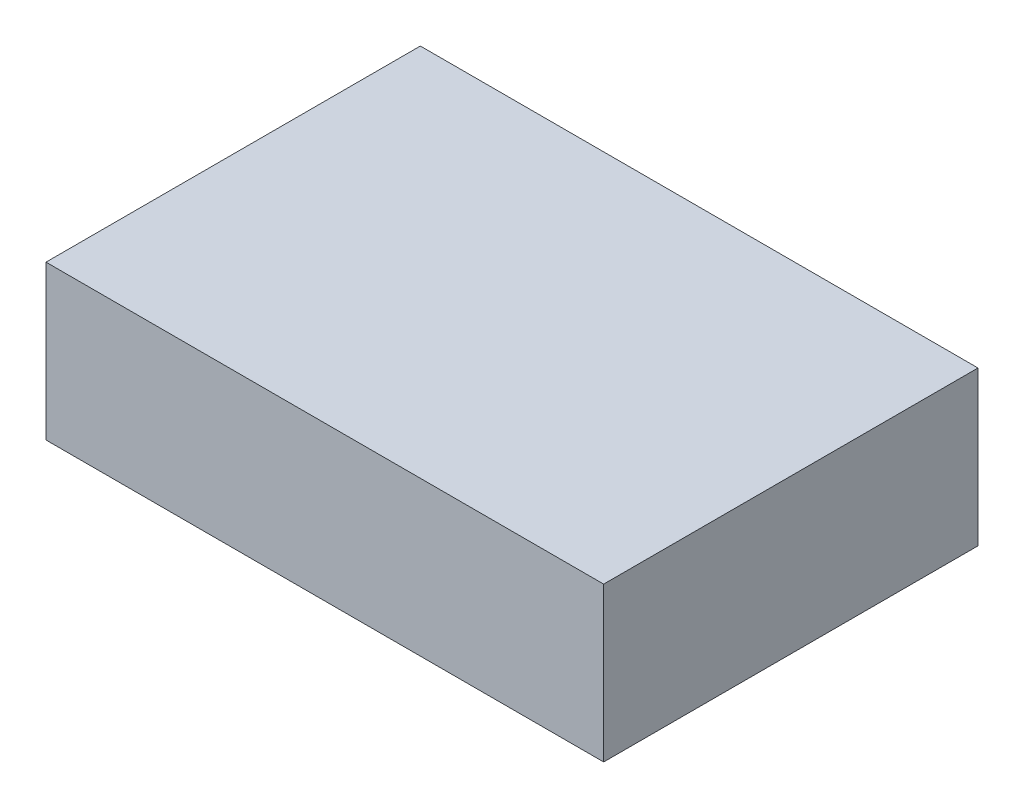
ISO-10303-21;
HEADER;
FILE_DESCRIPTION(('STEP AP214'),'2;1');
FILE_NAME('part.step','',(''),(''),'','','');
FILE_SCHEMA(('AUTOMOTIVE_DESIGN { 1 0 10303 214 1 1 1 1 }'));
ENDSEC;
DATA;
#1=APPLICATION_CONTEXT('core data for automotive mechanical design processes');
#2=APPLICATION_PROTOCOL_DEFINITION('international standard','automotive_design',2000,#1);
#3=PRODUCT_CONTEXT('',#1,'mechanical');
#4=PRODUCT('Part','Part','',(#3));
#5=PRODUCT_RELATED_PRODUCT_CATEGORY('part','',(#4));
#6=PRODUCT_DEFINITION_FORMATION('','',#4);
#7=PRODUCT_DEFINITION_CONTEXT('part definition',#1,'design');
#8=PRODUCT_DEFINITION('design','',#6,#7);
#9=PRODUCT_DEFINITION_SHAPE('','',#8);
#10=(LENGTH_UNIT() NAMED_UNIT(*) SI_UNIT(.MILLI.,.METRE.));
#11=(NAMED_UNIT(*) PLANE_ANGLE_UNIT() SI_UNIT($,.RADIAN.));
#12=(NAMED_UNIT(*) SI_UNIT($,.STERADIAN.) SOLID_ANGLE_UNIT());
#13=UNCERTAINTY_MEASURE_WITH_UNIT(LENGTH_MEASURE(1.E-05),#10,'distance_accuracy_value','');
#14=(GEOMETRIC_REPRESENTATION_CONTEXT(3) GLOBAL_UNCERTAINTY_ASSIGNED_CONTEXT((#13)) GLOBAL_UNIT_ASSIGNED_CONTEXT((#10,
#11,#12)) REPRESENTATION_CONTEXT('',''));
#15=CARTESIAN_POINT('',(0.,0.,0.));
#16=DIRECTION('',(0.,0.,1.));
#17=DIRECTION('',(1.,0.,0.));
#18=AXIS2_PLACEMENT_3D('',#15,#16,#17);
#19=CARTESIAN_POINT('',(18.1,10.,12.15));
#20=DIRECTION('',(-1.,0.,0.));
#21=DIRECTION('',(0.,0.,1.));
#22=AXIS2_PLACEMENT_3D('',#19,#20,#21);
#23=PLANE('',#22);
#24=DIRECTION('',(0.,0.,-1.));
#25=VECTOR('',#24,1.);
#26=CARTESIAN_POINT('',(18.1,0.,12.15));
#27=LINE('',#26,#25);
#28=CARTESIAN_POINT('',(18.1,0.,12.15));
#29=VERTEX_POINT('',#28);
#30=CARTESIAN_POINT('',(18.1,0.,-12.15));
#31=VERTEX_POINT('',#30);
#32=EDGE_CURVE('E113',#29,#31,#27,.T.);
#33=ORIENTED_EDGE('',*,*,#32,.T.);
#34=DIRECTION('',(0.,-1.,0.));
#35=VECTOR('',#34,1.);
#36=CARTESIAN_POINT('',(18.1,10.,-12.15));
#37=LINE('',#36,#35);
#38=CARTESIAN_POINT('',(18.1,10.,-12.15));
#39=VERTEX_POINT('',#38);
#40=EDGE_CURVE('E11',#39,#31,#37,.T.);
#41=ORIENTED_EDGE('',*,*,#40,.F.);
#42=DIRECTION('',(0.,0.,-1.));
#43=VECTOR('',#42,1.);
#44=CARTESIAN_POINT('',(18.1,10.,12.15));
#45=LINE('',#44,#43);
#46=CARTESIAN_POINT('',(18.1,10.,12.15));
#47=VERTEX_POINT('',#46);
#48=EDGE_CURVE('E97',#47,#39,#45,.T.);
#49=ORIENTED_EDGE('',*,*,#48,.F.);
#50=DIRECTION('',(0.,-1.,0.));
#51=VECTOR('',#50,1.);
#52=CARTESIAN_POINT('',(18.1,10.,12.15));
#53=LINE('',#52,#51);
#54=EDGE_CURVE('E109',#47,#29,#53,.T.);
#55=ORIENTED_EDGE('',*,*,#54,.T.);
#56=EDGE_LOOP('',(#33,#41,#49,#55));
#57=FACE_BOUND('',#56,.T.);
#58=ADVANCED_FACE('F45',(#57),#23,.F.);
#59=CARTESIAN_POINT('',(-18.1,10.,-12.15));
#60=DIRECTION('',(0.,0.,1.));
#61=DIRECTION('',(1.,0.,0.));
#62=AXIS2_PLACEMENT_3D('',#59,#60,#61);
#63=PLANE('',#62);
#64=DIRECTION('',(-1.,0.,0.));
#65=VECTOR('',#64,1.);
#66=CARTESIAN_POINT('',(-18.1,0.,-12.15));
#67=LINE('',#66,#65);
#68=CARTESIAN_POINT('',(-18.1,0.,-12.15));
#69=VERTEX_POINT('',#68);
#70=EDGE_CURVE('E102',#31,#69,#67,.T.);
#71=ORIENTED_EDGE('',*,*,#70,.T.);
#72=DIRECTION('',(0.,-1.,0.));
#73=VECTOR('',#72,1.);
#74=CARTESIAN_POINT('',(-18.1,10.,-12.15));
#75=LINE('',#74,#73);
#76=CARTESIAN_POINT('',(-18.1,10.,-12.15));
#77=VERTEX_POINT('',#76);
#78=EDGE_CURVE('E54',#77,#69,#75,.T.);
#79=ORIENTED_EDGE('',*,*,#78,.F.);
#80=DIRECTION('',(-1.,0.,0.));
#81=VECTOR('',#80,1.);
#82=CARTESIAN_POINT('',(-18.1,10.,-12.15));
#83=LINE('',#82,#81);
#84=EDGE_CURVE('E92',#39,#77,#83,.T.);
#85=ORIENTED_EDGE('',*,*,#84,.F.);
#86=ORIENTED_EDGE('',*,*,#40,.T.);
#87=EDGE_LOOP('',(#71,#79,#85,#86));
#88=FACE_BOUND('',#87,.T.);
#89=ADVANCED_FACE('F101',(#88),#63,.F.);
#90=CARTESIAN_POINT('',(-18.1,10.,12.15));
#91=DIRECTION('',(1.,0.,0.));
#92=DIRECTION('',(0.,0.,-1.));
#93=AXIS2_PLACEMENT_3D('',#90,#91,#92);
#94=PLANE('',#93);
#95=DIRECTION('',(0.,0.,1.));
#96=VECTOR('',#95,1.);
#97=CARTESIAN_POINT('',(-18.1,0.,12.15));
#98=LINE('',#97,#96);
#99=CARTESIAN_POINT('',(-18.1,0.,12.15));
#100=VERTEX_POINT('',#99);
#101=EDGE_CURVE('E79',#69,#100,#98,.T.);
#102=ORIENTED_EDGE('',*,*,#101,.T.);
#103=DIRECTION('',(0.,-1.,0.));
#104=VECTOR('',#103,1.);
#105=CARTESIAN_POINT('',(-18.1,10.,12.15));
#106=LINE('',#105,#104);
#107=CARTESIAN_POINT('',(-18.1,10.,12.15));
#108=VERTEX_POINT('',#107);
#109=EDGE_CURVE('E104',#108,#100,#106,.T.);
#110=ORIENTED_EDGE('',*,*,#109,.F.);
#111=DIRECTION('',(0.,0.,1.));
#112=VECTOR('',#111,1.);
#113=CARTESIAN_POINT('',(-18.1,10.,12.15));
#114=LINE('',#113,#112);
#115=EDGE_CURVE('E95',#77,#108,#114,.T.);
#116=ORIENTED_EDGE('',*,*,#115,.F.);
#117=ORIENTED_EDGE('',*,*,#78,.T.);
#118=EDGE_LOOP('',(#102,#110,#116,#117));
#119=FACE_BOUND('',#118,.T.);
#120=ADVANCED_FACE('F105',(#119),#94,.F.);
#121=CARTESIAN_POINT('',(-18.1,10.,12.15));
#122=DIRECTION('',(0.,0.,-1.));
#123=DIRECTION('',(-1.,0.,0.));
#124=AXIS2_PLACEMENT_3D('',#121,#122,#123);
#125=PLANE('',#124);
#126=DIRECTION('',(1.,0.,0.));
#127=VECTOR('',#126,1.);
#128=CARTESIAN_POINT('',(-18.1,0.,12.15));
#129=LINE('',#128,#127);
#130=EDGE_CURVE('E85',#100,#29,#129,.T.);
#131=ORIENTED_EDGE('',*,*,#130,.T.);
#132=ORIENTED_EDGE('',*,*,#54,.F.);
#133=DIRECTION('',(1.,0.,0.));
#134=VECTOR('',#133,1.);
#135=CARTESIAN_POINT('',(-18.1,10.,12.15));
#136=LINE('',#135,#134);
#137=EDGE_CURVE('E62',#108,#47,#136,.T.);
#138=ORIENTED_EDGE('',*,*,#137,.F.);
#139=ORIENTED_EDGE('',*,*,#109,.T.);
#140=EDGE_LOOP('',(#131,#132,#138,#139));
#141=FACE_BOUND('',#140,.T.);
#142=ADVANCED_FACE('F126',(#141),#125,.F.);
#143=CARTESIAN_POINT('',(0.,10.,0.));
#144=DIRECTION('',(0.,-1.,0.));
#145=DIRECTION('',(0.,0.,-1.));
#146=AXIS2_PLACEMENT_3D('',#143,#144,#145);
#147=PLANE('',#146);
#148=ORIENTED_EDGE('',*,*,#48,.T.);
#149=ORIENTED_EDGE('',*,*,#84,.T.);
#150=ORIENTED_EDGE('',*,*,#115,.T.);
#151=ORIENTED_EDGE('',*,*,#137,.T.);
#152=EDGE_LOOP('',(#148,#149,#150,#151));
#153=FACE_BOUND('',#152,.T.);
#154=ADVANCED_FACE('F93',(#153),#147,.F.);
#155=CARTESIAN_POINT('',(0.,0.,0.));
#156=DIRECTION('',(0.,-1.,0.));
#157=DIRECTION('',(0.,0.,-1.));
#158=AXIS2_PLACEMENT_3D('',#155,#156,#157);
#159=PLANE('',#158);
#160=ORIENTED_EDGE('',*,*,#32,.F.);
#161=ORIENTED_EDGE('',*,*,#130,.F.);
#162=ORIENTED_EDGE('',*,*,#101,.F.);
#163=ORIENTED_EDGE('',*,*,#70,.F.);
#164=EDGE_LOOP('',(#160,#161,#162,#163));
#165=FACE_BOUND('',#164,.T.);
#166=ADVANCED_FACE('F129',(#165),#159,.T.);
#167=CLOSED_SHELL('',(#58,#89,#120,#142,#154,#166));
#168=MANIFOLD_SOLID_BREP('B2',#167);
#169=ADVANCED_BREP_SHAPE_REPRESENTATION('',(#18,#168),#14);
#170=SHAPE_DEFINITION_REPRESENTATION(#9,#169);
ENDSEC;
END-ISO-10303-21;
